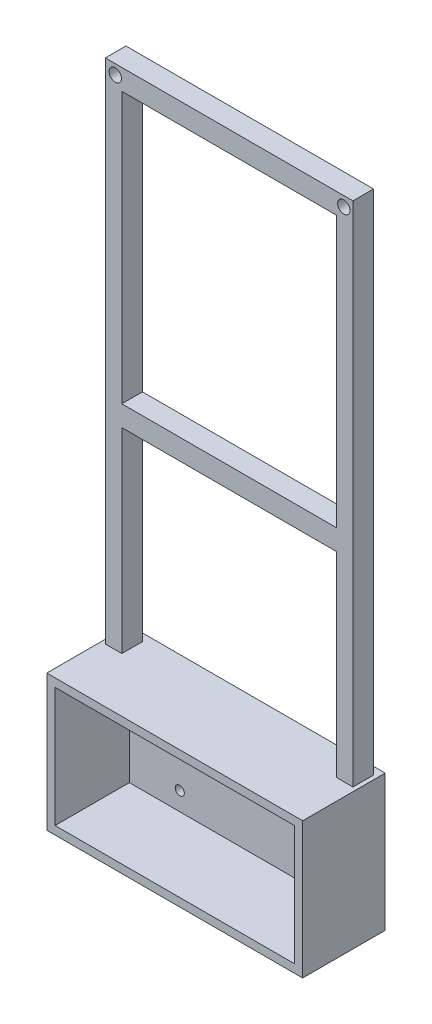
ISO-10303-21;
HEADER;
FILE_DESCRIPTION(('STEP AP214'),'2;1');
FILE_NAME('part.step','',(''),(''),'','','');
FILE_SCHEMA(('AUTOMOTIVE_DESIGN { 1 0 10303 214 1 1 1 1 }'));
ENDSEC;
DATA;
#1=APPLICATION_CONTEXT('core data for automotive mechanical design processes');
#2=APPLICATION_PROTOCOL_DEFINITION('international standard','automotive_design',2000,#1);
#3=PRODUCT_CONTEXT('',#1,'mechanical');
#4=PRODUCT('Part','Part','',(#3));
#5=PRODUCT_RELATED_PRODUCT_CATEGORY('part','',(#4));
#6=PRODUCT_DEFINITION_FORMATION('','',#4);
#7=PRODUCT_DEFINITION_CONTEXT('part definition',#1,'design');
#8=PRODUCT_DEFINITION('design','',#6,#7);
#9=PRODUCT_DEFINITION_SHAPE('','',#8);
#10=(LENGTH_UNIT() NAMED_UNIT(*) SI_UNIT(.MILLI.,.METRE.));
#11=(NAMED_UNIT(*) PLANE_ANGLE_UNIT() SI_UNIT($,.RADIAN.));
#12=(NAMED_UNIT(*) SI_UNIT($,.STERADIAN.) SOLID_ANGLE_UNIT());
#13=UNCERTAINTY_MEASURE_WITH_UNIT(LENGTH_MEASURE(1.E-05),#10,'distance_accuracy_value','');
#14=(GEOMETRIC_REPRESENTATION_CONTEXT(3) GLOBAL_UNCERTAINTY_ASSIGNED_CONTEXT((#13)) GLOBAL_UNIT_ASSIGNED_CONTEXT((#10,
#11,#12)) REPRESENTATION_CONTEXT('',''));
#15=CARTESIAN_POINT('',(0.,0.,0.));
#16=DIRECTION('',(0.,0.,1.));
#17=DIRECTION('',(1.,0.,0.));
#18=AXIS2_PLACEMENT_3D('',#15,#16,#17);
#19=CARTESIAN_POINT('',(26.,139.5,6.82452258581444));
#20=DIRECTION('',(1.,0.,0.));
#21=DIRECTION('',(0.,0.,-1.));
#22=AXIS2_PLACEMENT_3D('',#19,#20,#21);
#23=PLANE('',#22);
#24=DIRECTION('',(0.,0.,1.));
#25=VECTOR('',#24,1.);
#26=CARTESIAN_POINT('',(26.,134.500222113458,6.82452258581444));
#27=LINE('',#26,#25);
#28=CARTESIAN_POINT('',(26.,134.500222113458,1.82452258581444));
#29=VERTEX_POINT('',#28);
#30=CARTESIAN_POINT('',(26.,134.500222113458,6.82452258581444));
#31=VERTEX_POINT('',#30);
#32=EDGE_CURVE('E192',#29,#31,#27,.T.);
#33=ORIENTED_EDGE('',*,*,#32,.F.);
#34=DIRECTION('',(0.,-1.,0.));
#35=VECTOR('',#34,1.);
#36=CARTESIAN_POINT('',(26.,139.5,1.82452258581444));
#37=LINE('',#36,#35);
#38=CARTESIAN_POINT('',(26.,68.9173370042198,1.82452258581444));
#39=VERTEX_POINT('',#38);
#40=EDGE_CURVE('E235',#29,#39,#37,.T.);
#41=ORIENTED_EDGE('',*,*,#40,.T.);
#42=DIRECTION('',(0.,0.,1.));
#43=VECTOR('',#42,1.);
#44=CARTESIAN_POINT('',(26.,68.9173370042198,6.82452258581444));
#45=LINE('',#44,#43);
#46=CARTESIAN_POINT('',(26.,68.9173370042198,6.82452258581444));
#47=VERTEX_POINT('',#46);
#48=EDGE_CURVE('E395',#39,#47,#45,.T.);
#49=ORIENTED_EDGE('',*,*,#48,.T.);
#50=DIRECTION('',(0.,-1.,0.));
#51=VECTOR('',#50,1.);
#52=CARTESIAN_POINT('',(26.,139.5,6.82452258581444));
#53=LINE('',#52,#51);
#54=EDGE_CURVE('E62',#31,#47,#53,.T.);
#55=ORIENTED_EDGE('',*,*,#54,.F.);
#56=EDGE_LOOP('',(#33,#41,#49,#55));
#57=FACE_BOUND('',#56,.T.);
#58=ADVANCED_FACE('F44',(#57),#23,.F.);
#59=CARTESIAN_POINT('',(-26.,139.5,6.82452258581444));
#60=DIRECTION('',(-1.,0.,0.));
#61=DIRECTION('',(0.,0.,1.));
#62=AXIS2_PLACEMENT_3D('',#59,#60,#61);
#63=PLANE('',#62);
#64=DIRECTION('',(0.,0.,-1.));
#65=VECTOR('',#64,1.);
#66=CARTESIAN_POINT('',(-26.,134.500222113458,6.82452258581444));
#67=LINE('',#66,#65);
#68=CARTESIAN_POINT('',(-26.,134.500222113458,6.82452258581444));
#69=VERTEX_POINT('',#68);
#70=CARTESIAN_POINT('',(-26.,134.500222113458,1.82452258581444));
#71=VERTEX_POINT('',#70);
#72=EDGE_CURVE('E189',#69,#71,#67,.T.);
#73=ORIENTED_EDGE('',*,*,#72,.F.);
#74=DIRECTION('',(0.,-1.,0.));
#75=VECTOR('',#74,1.);
#76=CARTESIAN_POINT('',(-26.,139.5,6.82452258581444));
#77=LINE('',#76,#75);
#78=CARTESIAN_POINT('',(-26.,68.9173370042198,6.82452258581444));
#79=VERTEX_POINT('',#78);
#80=EDGE_CURVE('E200',#69,#79,#77,.T.);
#81=ORIENTED_EDGE('',*,*,#80,.T.);
#82=DIRECTION('',(0.,0.,-1.));
#83=VECTOR('',#82,1.);
#84=CARTESIAN_POINT('',(-26.,68.9173370042198,6.82452258581444));
#85=LINE('',#84,#83);
#86=CARTESIAN_POINT('',(-26.,68.9173370042198,1.82452258581444));
#87=VERTEX_POINT('',#86);
#88=EDGE_CURVE('E384',#79,#87,#85,.T.);
#89=ORIENTED_EDGE('',*,*,#88,.T.);
#90=DIRECTION('',(0.,-1.,0.));
#91=VECTOR('',#90,1.);
#92=CARTESIAN_POINT('',(-26.,139.5,1.82452258581444));
#93=LINE('',#92,#91);
#94=EDGE_CURVE('E201',#71,#87,#93,.T.);
#95=ORIENTED_EDGE('',*,*,#94,.F.);
#96=EDGE_LOOP('',(#73,#81,#89,#95));
#97=FACE_BOUND('',#96,.T.);
#98=ADVANCED_FACE('F198',(#97),#63,.F.);
#99=DIRECTION('',(0.,0.,1.));
#100=VECTOR('',#99,1.);
#101=CARTESIAN_POINT('',(26.,63.9173370042198,6.82452258581444));
#102=LINE('',#101,#100);
#103=CARTESIAN_POINT('',(26.,63.9173370042198,1.82452258581444));
#104=VERTEX_POINT('',#103);
#105=CARTESIAN_POINT('',(26.,63.9173370042198,6.82452258581444));
#106=VERTEX_POINT('',#105);
#107=EDGE_CURVE('E234',#104,#106,#102,.T.);
#108=ORIENTED_EDGE('',*,*,#107,.F.);
#109=CARTESIAN_POINT('',(26.,16.5,1.82452258581444));
#110=VERTEX_POINT('',#109);
#111=EDGE_CURVE('E233',#104,#110,#37,.T.);
#112=ORIENTED_EDGE('',*,*,#111,.T.);
#113=DIRECTION('',(0.,0.,1.));
#114=VECTOR('',#113,1.);
#115=CARTESIAN_POINT('',(26.,16.5,6.82452258581444));
#116=LINE('',#115,#114);
#117=CARTESIAN_POINT('',(26.,16.5,6.82452258581444));
#118=VERTEX_POINT('',#117);
#119=EDGE_CURVE('E250',#110,#118,#116,.T.);
#120=ORIENTED_EDGE('',*,*,#119,.T.);
#121=EDGE_CURVE('E238',#106,#118,#53,.T.);
#122=ORIENTED_EDGE('',*,*,#121,.F.);
#123=EDGE_LOOP('',(#108,#112,#120,#122));
#124=FACE_BOUND('',#123,.T.);
#125=ADVANCED_FACE('F444',(#124),#23,.F.);
#126=DIRECTION('',(0.,0.,-1.));
#127=VECTOR('',#126,1.);
#128=CARTESIAN_POINT('',(-26.,63.9173370042198,6.82452258581444));
#129=LINE('',#128,#127);
#130=CARTESIAN_POINT('',(-26.,63.9173370042198,6.82452258581444));
#131=VERTEX_POINT('',#130);
#132=CARTESIAN_POINT('',(-26.,63.9173370042198,1.82452258581444));
#133=VERTEX_POINT('',#132);
#134=EDGE_CURVE('E387',#131,#133,#129,.T.);
#135=ORIENTED_EDGE('',*,*,#134,.F.);
#136=CARTESIAN_POINT('',(-26.,16.5,6.82452258581444));
#137=VERTEX_POINT('',#136);
#138=EDGE_CURVE('E211',#131,#137,#77,.T.);
#139=ORIENTED_EDGE('',*,*,#138,.T.);
#140=DIRECTION('',(0.,0.,-1.));
#141=VECTOR('',#140,1.);
#142=CARTESIAN_POINT('',(-26.,16.5,6.82452258581444));
#143=LINE('',#142,#141);
#144=CARTESIAN_POINT('',(-26.,16.5,1.82452258581444));
#145=VERTEX_POINT('',#144);
#146=EDGE_CURVE('E262',#137,#145,#143,.T.);
#147=ORIENTED_EDGE('',*,*,#146,.T.);
#148=EDGE_CURVE('E70',#133,#145,#93,.T.);
#149=ORIENTED_EDGE('',*,*,#148,.F.);
#150=EDGE_LOOP('',(#135,#139,#147,#149));
#151=FACE_BOUND('',#150,.T.);
#152=ADVANCED_FACE('F437',(#151),#63,.F.);
#153=CARTESIAN_POINT('',(-31.,16.5,20.));
#154=DIRECTION('',(0.,-1.,0.));
#155=DIRECTION('',(0.,0.,-1.));
#156=AXIS2_PLACEMENT_3D('',#153,#154,#155);
#157=PLANE('',#156);
#158=DIRECTION('',(0.,0.,-1.));
#159=VECTOR('',#158,1.);
#160=CARTESIAN_POINT('',(30.,16.5,6.82452258581444));
#161=LINE('',#160,#159);
#162=CARTESIAN_POINT('',(30.,16.5,6.82452258581444));
#163=VERTEX_POINT('',#162);
#164=CARTESIAN_POINT('',(30.,16.5,1.82452258581444));
#165=VERTEX_POINT('',#164);
#166=EDGE_CURVE('E258',#163,#165,#161,.T.);
#167=ORIENTED_EDGE('',*,*,#166,.F.);
#168=DIRECTION('',(1.,0.,0.));
#169=VECTOR('',#168,1.);
#170=CARTESIAN_POINT('',(26.,16.5,6.82452258581444));
#171=LINE('',#170,#169);
#172=EDGE_CURVE('E246',#118,#163,#171,.T.);
#173=ORIENTED_EDGE('',*,*,#172,.F.);
#174=ORIENTED_EDGE('',*,*,#119,.F.);
#175=DIRECTION('',(-1.,0.,0.));
#176=VECTOR('',#175,1.);
#177=CARTESIAN_POINT('',(26.,16.5,1.82452258581444));
#178=LINE('',#177,#176);
#179=EDGE_CURVE('E254',#165,#110,#178,.T.);
#180=ORIENTED_EDGE('',*,*,#179,.F.);
#181=EDGE_LOOP('',(#167,#173,#174,#180));
#182=FACE_BOUND('',#181,.T.);
#183=DIRECTION('',(-1.,0.,0.));
#184=VECTOR('',#183,1.);
#185=CARTESIAN_POINT('',(-31.,16.5,0.));
#186=LINE('',#185,#184);
#187=CARTESIAN_POINT('',(31.,16.5,0.));
#188=VERTEX_POINT('',#187);
#189=CARTESIAN_POINT('',(-31.,16.5,0.));
#190=VERTEX_POINT('',#189);
#191=EDGE_CURVE('E326',#188,#190,#186,.T.);
#192=ORIENTED_EDGE('',*,*,#191,.T.);
#193=DIRECTION('',(0.,0.,-1.));
#194=VECTOR('',#193,1.);
#195=CARTESIAN_POINT('',(-31.,16.5,20.));
#196=LINE('',#195,#194);
#197=CARTESIAN_POINT('',(-31.,16.5,20.));
#198=VERTEX_POINT('',#197);
#199=EDGE_CURVE('E54',#198,#190,#196,.T.);
#200=ORIENTED_EDGE('',*,*,#199,.F.);
#201=DIRECTION('',(-1.,0.,0.));
#202=VECTOR('',#201,1.);
#203=CARTESIAN_POINT('',(-31.,16.5,20.));
#204=LINE('',#203,#202);
#205=CARTESIAN_POINT('',(31.,16.5,20.));
#206=VERTEX_POINT('',#205);
#207=EDGE_CURVE('E312',#206,#198,#204,.T.);
#208=ORIENTED_EDGE('',*,*,#207,.F.);
#209=DIRECTION('',(0.,0.,-1.));
#210=VECTOR('',#209,1.);
#211=CARTESIAN_POINT('',(31.,16.5,20.));
#212=LINE('',#211,#210);
#213=EDGE_CURVE('E11',#206,#188,#212,.T.);
#214=ORIENTED_EDGE('',*,*,#213,.T.);
#215=EDGE_LOOP('',(#192,#200,#208,#214));
#216=FACE_BOUND('',#215,.T.);
#217=ORIENTED_EDGE('',*,*,#146,.F.);
#218=DIRECTION('',(1.,0.,0.));
#219=VECTOR('',#218,1.);
#220=CARTESIAN_POINT('',(-30.,16.5,6.82452258581444));
#221=LINE('',#220,#219);
#222=CARTESIAN_POINT('',(-30.,16.5,6.82452258581444));
#223=VERTEX_POINT('',#222);
#224=EDGE_CURVE('E220',#223,#137,#221,.T.);
#225=ORIENTED_EDGE('',*,*,#224,.F.);
#226=DIRECTION('',(0.,0.,1.));
#227=VECTOR('',#226,1.);
#228=CARTESIAN_POINT('',(-30.,16.5,6.82452258581444));
#229=LINE('',#228,#227);
#230=CARTESIAN_POINT('',(-30.,16.5,1.82452258581444));
#231=VERTEX_POINT('',#230);
#232=EDGE_CURVE('E423',#231,#223,#229,.T.);
#233=ORIENTED_EDGE('',*,*,#232,.F.);
#234=DIRECTION('',(-1.,0.,0.));
#235=VECTOR('',#234,1.);
#236=CARTESIAN_POINT('',(-30.,16.5,1.82452258581444));
#237=LINE('',#236,#235);
#238=EDGE_CURVE('E420',#145,#231,#237,.T.);
#239=ORIENTED_EDGE('',*,*,#238,.F.);
#240=EDGE_LOOP('',(#217,#225,#233,#239));
#241=FACE_BOUND('',#240,.T.);
#242=ADVANCED_FACE('F435',(#182,#216,#241),#157,.F.);
#243=CARTESIAN_POINT('',(0.,0.,20.));
#244=DIRECTION('',(0.,0.,-1.));
#245=DIRECTION('',(-1.,0.,0.));
#246=AXIS2_PLACEMENT_3D('',#243,#244,#245);
#247=PLANE('',#246);
#248=DIRECTION('',(0.,1.,0.));
#249=VECTOR('',#248,1.);
#250=CARTESIAN_POINT('',(31.,-16.5,20.));
#251=LINE('',#250,#249);
#252=CARTESIAN_POINT('',(31.,-16.5,20.));
#253=VERTEX_POINT('',#252);
#254=EDGE_CURVE('E308',#253,#206,#251,.T.);
#255=ORIENTED_EDGE('',*,*,#254,.T.);
#256=ORIENTED_EDGE('',*,*,#207,.T.);
#257=DIRECTION('',(0.,-1.,0.));
#258=VECTOR('',#257,1.);
#259=CARTESIAN_POINT('',(-31.,-16.5,20.));
#260=LINE('',#259,#258);
#261=CARTESIAN_POINT('',(-31.,-16.5,20.));
#262=VERTEX_POINT('',#261);
#263=EDGE_CURVE('E316',#198,#262,#260,.T.);
#264=ORIENTED_EDGE('',*,*,#263,.T.);
#265=DIRECTION('',(1.,0.,0.));
#266=VECTOR('',#265,1.);
#267=CARTESIAN_POINT('',(-31.,-16.5,20.));
#268=LINE('',#267,#266);
#269=EDGE_CURVE('E319',#262,#253,#268,.T.);
#270=ORIENTED_EDGE('',*,*,#269,.T.);
#271=EDGE_LOOP('',(#255,#256,#264,#270));
#272=FACE_BOUND('',#271,.T.);
#273=DIRECTION('',(0.,1.,0.));
#274=VECTOR('',#273,1.);
#275=CARTESIAN_POINT('',(29.,0.,20.));
#276=LINE('',#275,#274);
#277=CARTESIAN_POINT('',(29.,-14.5,20.));
#278=VERTEX_POINT('',#277);
#279=CARTESIAN_POINT('',(29.,14.5,20.));
#280=VERTEX_POINT('',#279);
#281=EDGE_CURVE('E296',#278,#280,#276,.T.);
#282=ORIENTED_EDGE('',*,*,#281,.F.);
#283=DIRECTION('',(1.,0.,0.));
#284=VECTOR('',#283,1.);
#285=CARTESIAN_POINT('',(0.,-14.5,20.));
#286=LINE('',#285,#284);
#287=CARTESIAN_POINT('',(-29.,-14.5,20.));
#288=VERTEX_POINT('',#287);
#289=EDGE_CURVE('E281',#288,#278,#286,.T.);
#290=ORIENTED_EDGE('',*,*,#289,.F.);
#291=DIRECTION('',(0.,-1.,0.));
#292=VECTOR('',#291,1.);
#293=CARTESIAN_POINT('',(-29.,0.,20.));
#294=LINE('',#293,#292);
#295=CARTESIAN_POINT('',(-29.,14.5,20.));
#296=VERTEX_POINT('',#295);
#297=EDGE_CURVE('E302',#296,#288,#294,.T.);
#298=ORIENTED_EDGE('',*,*,#297,.F.);
#299=DIRECTION('',(-1.,0.,0.));
#300=VECTOR('',#299,1.);
#301=CARTESIAN_POINT('',(0.,14.5,20.));
#302=LINE('',#301,#300);
#303=EDGE_CURVE('E299',#280,#296,#302,.T.);
#304=ORIENTED_EDGE('',*,*,#303,.F.);
#305=EDGE_LOOP('',(#282,#290,#298,#304));
#306=FACE_BOUND('',#305,.T.);
#307=ADVANCED_FACE('F491',(#272,#306),#247,.F.);
#308=CARTESIAN_POINT('',(31.,-16.5,20.));
#309=DIRECTION('',(-1.,0.,0.));
#310=DIRECTION('',(0.,0.,1.));
#311=AXIS2_PLACEMENT_3D('',#308,#309,#310);
#312=PLANE('',#311);
#313=DIRECTION('',(0.,1.,0.));
#314=VECTOR('',#313,1.);
#315=CARTESIAN_POINT('',(31.,-16.5,0.));
#316=LINE('',#315,#314);
#317=CARTESIAN_POINT('',(31.,-16.5,0.));
#318=VERTEX_POINT('',#317);
#319=EDGE_CURVE('E274',#318,#188,#316,.T.);
#320=ORIENTED_EDGE('',*,*,#319,.T.);
#321=ORIENTED_EDGE('',*,*,#213,.F.);
#322=ORIENTED_EDGE('',*,*,#254,.F.);
#323=DIRECTION('',(0.,0.,-1.));
#324=VECTOR('',#323,1.);
#325=CARTESIAN_POINT('',(31.,-16.5,20.));
#326=LINE('',#325,#324);
#327=EDGE_CURVE('E322',#253,#318,#326,.T.);
#328=ORIENTED_EDGE('',*,*,#327,.T.);
#329=EDGE_LOOP('',(#320,#321,#322,#328));
#330=FACE_BOUND('',#329,.T.);
#331=ADVANCED_FACE('F46',(#330),#312,.F.);
#332=CARTESIAN_POINT('',(-31.,-16.5,20.));
#333=DIRECTION('',(1.,0.,0.));
#334=DIRECTION('',(0.,0.,-1.));
#335=AXIS2_PLACEMENT_3D('',#332,#333,#334);
#336=PLANE('',#335);
#337=DIRECTION('',(0.,-1.,0.));
#338=VECTOR('',#337,1.);
#339=CARTESIAN_POINT('',(-31.,-16.5,0.));
#340=LINE('',#339,#338);
#341=CARTESIAN_POINT('',(-31.,-16.5,0.));
#342=VERTEX_POINT('',#341);
#343=EDGE_CURVE('E329',#190,#342,#340,.T.);
#344=ORIENTED_EDGE('',*,*,#343,.T.);
#345=DIRECTION('',(0.,0.,-1.));
#346=VECTOR('',#345,1.);
#347=CARTESIAN_POINT('',(-31.,-16.5,20.));
#348=LINE('',#347,#346);
#349=EDGE_CURVE('E337',#262,#342,#348,.T.);
#350=ORIENTED_EDGE('',*,*,#349,.F.);
#351=ORIENTED_EDGE('',*,*,#263,.F.);
#352=ORIENTED_EDGE('',*,*,#199,.T.);
#353=EDGE_LOOP('',(#344,#350,#351,#352));
#354=FACE_BOUND('',#353,.T.);
#355=ADVANCED_FACE('F518',(#354),#336,.F.);
#356=CARTESIAN_POINT('',(-31.,-16.5,20.));
#357=DIRECTION('',(0.,1.,0.));
#358=DIRECTION('',(0.,0.,1.));
#359=AXIS2_PLACEMENT_3D('',#356,#357,#358);
#360=PLANE('',#359);
#361=DIRECTION('',(1.,0.,0.));
#362=VECTOR('',#361,1.);
#363=CARTESIAN_POINT('',(-31.,-16.5,0.));
#364=LINE('',#363,#362);
#365=EDGE_CURVE('E313',#342,#318,#364,.T.);
#366=ORIENTED_EDGE('',*,*,#365,.T.);
#367=ORIENTED_EDGE('',*,*,#327,.F.);
#368=ORIENTED_EDGE('',*,*,#269,.F.);
#369=ORIENTED_EDGE('',*,*,#349,.T.);
#370=EDGE_LOOP('',(#366,#367,#368,#369));
#371=FACE_BOUND('',#370,.T.);
#372=ADVANCED_FACE('F514',(#371),#360,.F.);
#373=CARTESIAN_POINT('',(0.,0.,0.));
#374=DIRECTION('',(0.,0.,-1.));
#375=DIRECTION('',(-1.,0.,0.));
#376=AXIS2_PLACEMENT_3D('',#373,#374,#375);
#377=PLANE('',#376);
#378=CARTESIAN_POINT('',(-16.7815720595793,9.95930811028381,0.));
#379=DIRECTION('',(0.,0.,-1.));
#380=DIRECTION('',(-1.,0.,0.));
#381=AXIS2_PLACEMENT_3D('',#378,#379,#380);
#382=CIRCLE('',#381,1.10000000000008);
#383=CARTESIAN_POINT('',(-17.8815720595794,9.95930811028381,0.));
#384=VERTEX_POINT('',#383);
#385=EDGE_CURVE('E729',#384,#384,#382,.T.);
#386=ORIENTED_EDGE('',*,*,#385,.F.);
#387=EDGE_LOOP('',(#386));
#388=FACE_BOUND('',#387,.T.);
#389=CARTESIAN_POINT('',(-16.7815720595793,-10.0406918897162,0.));
#390=DIRECTION('',(0.,0.,-1.));
#391=DIRECTION('',(-1.,0.,0.));
#392=AXIS2_PLACEMENT_3D('',#389,#390,#391);
#393=CIRCLE('',#392,1.10000000000008);
#394=CARTESIAN_POINT('',(-17.8815720595794,-10.0406918897162,0.));
#395=VERTEX_POINT('',#394);
#396=EDGE_CURVE('E731',#395,#395,#393,.T.);
#397=ORIENTED_EDGE('',*,*,#396,.F.);
#398=EDGE_LOOP('',(#397));
#399=FACE_BOUND('',#398,.T.);
#400=CARTESIAN_POINT('',(18.2184279404207,-10.0406918897162,0.));
#401=DIRECTION('',(0.,0.,-1.));
#402=DIRECTION('',(-1.,0.,0.));
#403=AXIS2_PLACEMENT_3D('',#400,#401,#402);
#404=CIRCLE('',#403,1.10000000000008);
#405=CARTESIAN_POINT('',(17.1184279404207,-10.0406918897162,0.));
#406=VERTEX_POINT('',#405);
#407=EDGE_CURVE('E735',#406,#406,#404,.T.);
#408=ORIENTED_EDGE('',*,*,#407,.F.);
#409=EDGE_LOOP('',(#408));
#410=FACE_BOUND('',#409,.T.);
#411=CARTESIAN_POINT('',(18.2184279404207,9.95930811028381,0.));
#412=DIRECTION('',(0.,0.,-1.));
#413=DIRECTION('',(-1.,0.,0.));
#414=AXIS2_PLACEMENT_3D('',#411,#412,#413);
#415=CIRCLE('',#414,1.10000000000008);
#416=CARTESIAN_POINT('',(17.1184279404207,9.95930811028381,0.));
#417=VERTEX_POINT('',#416);
#418=EDGE_CURVE('E349',#417,#417,#415,.T.);
#419=ORIENTED_EDGE('',*,*,#418,.F.);
#420=EDGE_LOOP('',(#419));
#421=FACE_BOUND('',#420,.T.);
#422=ORIENTED_EDGE('',*,*,#319,.F.);
#423=ORIENTED_EDGE('',*,*,#365,.F.);
#424=ORIENTED_EDGE('',*,*,#343,.F.);
#425=ORIENTED_EDGE('',*,*,#191,.F.);
#426=EDGE_LOOP('',(#422,#423,#424,#425));
#427=FACE_BOUND('',#426,.T.);
#428=ADVANCED_FACE('F511',(#388,#399,#410,#421,#427),#377,.T.);
#429=CARTESIAN_POINT('',(29.,-16.5,20.));
#430=DIRECTION('',(-1.,0.,0.));
#431=DIRECTION('',(0.,0.,1.));
#432=AXIS2_PLACEMENT_3D('',#429,#430,#431);
#433=PLANE('',#432);
#434=DIRECTION('',(0.,1.,0.));
#435=VECTOR('',#434,1.);
#436=CARTESIAN_POINT('',(29.,0.,2.));
#437=LINE('',#436,#435);
#438=CARTESIAN_POINT('',(29.,-14.5,2.));
#439=VERTEX_POINT('',#438);
#440=CARTESIAN_POINT('',(29.,14.5,2.));
#441=VERTEX_POINT('',#440);
#442=EDGE_CURVE('E228',#439,#441,#437,.T.);
#443=ORIENTED_EDGE('',*,*,#442,.F.);
#444=DIRECTION('',(0.,0.,-1.));
#445=VECTOR('',#444,1.);
#446=CARTESIAN_POINT('',(29.,-14.5,20.));
#447=LINE('',#446,#445);
#448=EDGE_CURVE('E276',#278,#439,#447,.T.);
#449=ORIENTED_EDGE('',*,*,#448,.F.);
#450=ORIENTED_EDGE('',*,*,#281,.T.);
#451=DIRECTION('',(0.,0.,-1.));
#452=VECTOR('',#451,1.);
#453=CARTESIAN_POINT('',(29.,14.5,20.));
#454=LINE('',#453,#452);
#455=EDGE_CURVE('E270',#280,#441,#454,.T.);
#456=ORIENTED_EDGE('',*,*,#455,.T.);
#457=EDGE_LOOP('',(#443,#449,#450,#456));
#458=FACE_BOUND('',#457,.T.);
#459=ADVANCED_FACE('F513',(#458),#433,.T.);
#460=CARTESIAN_POINT('',(-31.,14.5,20.));
#461=DIRECTION('',(0.,-1.,0.));
#462=DIRECTION('',(0.,0.,-1.));
#463=AXIS2_PLACEMENT_3D('',#460,#461,#462);
#464=PLANE('',#463);
#465=DIRECTION('',(-1.,0.,0.));
#466=VECTOR('',#465,1.);
#467=CARTESIAN_POINT('',(0.,14.5,2.));
#468=LINE('',#467,#466);
#469=CARTESIAN_POINT('',(-29.,14.5,2.));
#470=VERTEX_POINT('',#469);
#471=EDGE_CURVE('E269',#441,#470,#468,.T.);
#472=ORIENTED_EDGE('',*,*,#471,.F.);
#473=ORIENTED_EDGE('',*,*,#455,.F.);
#474=ORIENTED_EDGE('',*,*,#303,.T.);
#475=DIRECTION('',(0.,0.,-1.));
#476=VECTOR('',#475,1.);
#477=CARTESIAN_POINT('',(-29.,14.5,20.));
#478=LINE('',#477,#476);
#479=EDGE_CURVE('E275',#296,#470,#478,.T.);
#480=ORIENTED_EDGE('',*,*,#479,.T.);
#481=EDGE_LOOP('',(#472,#473,#474,#480));
#482=FACE_BOUND('',#481,.T.);
#483=ADVANCED_FACE('F547',(#482),#464,.T.);
#484=CARTESIAN_POINT('',(-29.,-16.5,20.));
#485=DIRECTION('',(1.,0.,0.));
#486=DIRECTION('',(0.,0.,-1.));
#487=AXIS2_PLACEMENT_3D('',#484,#485,#486);
#488=PLANE('',#487);
#489=DIRECTION('',(0.,-1.,0.));
#490=VECTOR('',#489,1.);
#491=CARTESIAN_POINT('',(-29.,0.,2.));
#492=LINE('',#491,#490);
#493=CARTESIAN_POINT('',(-29.,-14.5,2.));
#494=VERTEX_POINT('',#493);
#495=EDGE_CURVE('E284',#470,#494,#492,.T.);
#496=ORIENTED_EDGE('',*,*,#495,.F.);
#497=ORIENTED_EDGE('',*,*,#479,.F.);
#498=ORIENTED_EDGE('',*,*,#297,.T.);
#499=DIRECTION('',(0.,0.,-1.));
#500=VECTOR('',#499,1.);
#501=CARTESIAN_POINT('',(-29.,-14.5,20.));
#502=LINE('',#501,#500);
#503=EDGE_CURVE('E280',#288,#494,#502,.T.);
#504=ORIENTED_EDGE('',*,*,#503,.T.);
#505=EDGE_LOOP('',(#496,#497,#498,#504));
#506=FACE_BOUND('',#505,.T.);
#507=ADVANCED_FACE('F503',(#506),#488,.T.);
#508=CARTESIAN_POINT('',(-31.,-14.5,20.));
#509=DIRECTION('',(0.,1.,0.));
#510=DIRECTION('',(0.,0.,1.));
#511=AXIS2_PLACEMENT_3D('',#508,#509,#510);
#512=PLANE('',#511);
#513=DIRECTION('',(1.,0.,0.));
#514=VECTOR('',#513,1.);
#515=CARTESIAN_POINT('',(0.,-14.5,2.));
#516=LINE('',#515,#514);
#517=EDGE_CURVE('E290',#494,#439,#516,.T.);
#518=ORIENTED_EDGE('',*,*,#517,.F.);
#519=ORIENTED_EDGE('',*,*,#503,.F.);
#520=ORIENTED_EDGE('',*,*,#289,.T.);
#521=ORIENTED_EDGE('',*,*,#448,.T.);
#522=EDGE_LOOP('',(#518,#519,#520,#521));
#523=FACE_BOUND('',#522,.T.);
#524=ADVANCED_FACE('F496',(#523),#512,.T.);
#525=CARTESIAN_POINT('',(0.,0.,2.));
#526=DIRECTION('',(0.,0.,-1.));
#527=DIRECTION('',(-1.,0.,0.));
#528=AXIS2_PLACEMENT_3D('',#525,#526,#527);
#529=PLANE('',#528);
#530=CARTESIAN_POINT('',(-16.7815720595793,9.95930811028381,2.));
#531=DIRECTION('',(0.,0.,-1.));
#532=DIRECTION('',(-1.,0.,0.));
#533=AXIS2_PLACEMENT_3D('',#530,#531,#532);
#534=CIRCLE('',#533,1.10000000000008);
#535=CARTESIAN_POINT('',(-17.8815720595794,9.95930811028381,2.));
#536=VERTEX_POINT('',#535);
#537=EDGE_CURVE('E48',#536,#536,#534,.T.);
#538=ORIENTED_EDGE('',*,*,#537,.T.);
#539=EDGE_LOOP('',(#538));
#540=FACE_BOUND('',#539,.T.);
#541=CARTESIAN_POINT('',(-16.7815720595793,-10.0406918897162,2.));
#542=DIRECTION('',(0.,0.,-1.));
#543=DIRECTION('',(-1.,0.,0.));
#544=AXIS2_PLACEMENT_3D('',#541,#542,#543);
#545=CIRCLE('',#544,1.10000000000008);
#546=CARTESIAN_POINT('',(-17.8815720595794,-10.0406918897162,2.));
#547=VERTEX_POINT('',#546);
#548=EDGE_CURVE('E352',#547,#547,#545,.T.);
#549=ORIENTED_EDGE('',*,*,#548,.T.);
#550=EDGE_LOOP('',(#549));
#551=FACE_BOUND('',#550,.T.);
#552=CARTESIAN_POINT('',(18.2184279404207,-10.0406918897162,2.));
#553=DIRECTION('',(0.,0.,-1.));
#554=DIRECTION('',(-1.,0.,0.));
#555=AXIS2_PLACEMENT_3D('',#552,#553,#554);
#556=CIRCLE('',#555,1.10000000000008);
#557=CARTESIAN_POINT('',(17.1184279404207,-10.0406918897162,2.));
#558=VERTEX_POINT('',#557);
#559=EDGE_CURVE('E348',#558,#558,#556,.T.);
#560=ORIENTED_EDGE('',*,*,#559,.T.);
#561=EDGE_LOOP('',(#560));
#562=FACE_BOUND('',#561,.T.);
#563=CARTESIAN_POINT('',(18.2184279404207,9.95930811028381,2.));
#564=DIRECTION('',(0.,0.,-1.));
#565=DIRECTION('',(-1.,0.,0.));
#566=AXIS2_PLACEMENT_3D('',#563,#564,#565);
#567=CIRCLE('',#566,1.10000000000008);
#568=CARTESIAN_POINT('',(17.1184279404207,9.95930811028381,2.));
#569=VERTEX_POINT('',#568);
#570=EDGE_CURVE('E344',#569,#569,#567,.T.);
#571=ORIENTED_EDGE('',*,*,#570,.T.);
#572=EDGE_LOOP('',(#571));
#573=FACE_BOUND('',#572,.T.);
#574=ORIENTED_EDGE('',*,*,#442,.T.);
#575=ORIENTED_EDGE('',*,*,#471,.T.);
#576=ORIENTED_EDGE('',*,*,#495,.T.);
#577=ORIENTED_EDGE('',*,*,#517,.T.);
#578=EDGE_LOOP('',(#574,#575,#576,#577));
#579=FACE_BOUND('',#578,.T.);
#580=ADVANCED_FACE('F492',(#540,#551,#562,#573,#579),#529,.F.);
#581=CARTESIAN_POINT('',(30.,139.5,6.82452258581444));
#582=DIRECTION('',(-1.,0.,0.));
#583=DIRECTION('',(0.,0.,1.));
#584=AXIS2_PLACEMENT_3D('',#581,#582,#583);
#585=PLANE('',#584);
#586=ORIENTED_EDGE('',*,*,#166,.T.);
#587=DIRECTION('',(0.,-1.,0.));
#588=VECTOR('',#587,1.);
#589=CARTESIAN_POINT('',(30.,139.5,1.82452258581444));
#590=LINE('',#589,#588);
#591=CARTESIAN_POINT('',(30.,139.5,1.82452258581444));
#592=VERTEX_POINT('',#591);
#593=EDGE_CURVE('E229',#592,#165,#590,.T.);
#594=ORIENTED_EDGE('',*,*,#593,.F.);
#595=DIRECTION('',(0.,0.,-1.));
#596=VECTOR('',#595,1.);
#597=CARTESIAN_POINT('',(30.,139.5,6.82452258581444));
#598=LINE('',#597,#596);
#599=CARTESIAN_POINT('',(30.,139.5,6.82452258581444));
#600=VERTEX_POINT('',#599);
#601=EDGE_CURVE('E245',#600,#592,#598,.T.);
#602=ORIENTED_EDGE('',*,*,#601,.F.);
#603=DIRECTION('',(0.,-1.,0.));
#604=VECTOR('',#603,1.);
#605=CARTESIAN_POINT('',(30.,139.5,6.82452258581444));
#606=LINE('',#605,#604);
#607=EDGE_CURVE('E241',#600,#163,#606,.T.);
#608=ORIENTED_EDGE('',*,*,#607,.T.);
#609=EDGE_LOOP('',(#586,#594,#602,#608));
#610=FACE_BOUND('',#609,.T.);
#611=ADVANCED_FACE('F457',(#610),#585,.F.);
#612=CARTESIAN_POINT('',(-30.,139.5,1.82452258581444));
#613=DIRECTION('',(0.,0.,1.));
#614=DIRECTION('',(1.,0.,0.));
#615=AXIS2_PLACEMENT_3D('',#612,#613,#614);
#616=PLANE('',#615);
#617=CARTESIAN_POINT('',(-27.5881798026908,137.122373112526,1.82452258581444));
#618=DIRECTION('',(0.,0.,1.));
#619=DIRECTION('',(1.,0.,0.));
#620=AXIS2_PLACEMENT_3D('',#617,#618,#619);
#621=CIRCLE('',#620,1.5);
#622=CARTESIAN_POINT('',(-26.0881798026908,137.122373112526,1.82452258581444));
#623=VERTEX_POINT('',#622);
#624=EDGE_CURVE('E203',#623,#623,#621,.T.);
#625=ORIENTED_EDGE('',*,*,#624,.T.);
#626=EDGE_LOOP('',(#625));
#627=FACE_BOUND('',#626,.T.);
#628=CARTESIAN_POINT('',(27.8022545228368,137.122373112526,1.82452258581443));
#629=DIRECTION('',(0.,0.,1.));
#630=DIRECTION('',(1.,0.,0.));
#631=AXIS2_PLACEMENT_3D('',#628,#629,#630);
#632=CIRCLE('',#631,1.5);
#633=CARTESIAN_POINT('',(29.3022545228368,137.122373112526,1.82452258581443));
#634=VERTEX_POINT('',#633);
#635=EDGE_CURVE('E370',#634,#634,#632,.T.);
#636=ORIENTED_EDGE('',*,*,#635,.T.);
#637=EDGE_LOOP('',(#636));
#638=FACE_BOUND('',#637,.T.);
#639=ORIENTED_EDGE('',*,*,#40,.F.);
#640=DIRECTION('',(-1.,0.,0.));
#641=VECTOR('',#640,1.);
#642=CARTESIAN_POINT('',(27.,134.500222113458,1.82452258581444));
#643=LINE('',#642,#641);
#644=EDGE_CURVE('E195',#29,#71,#643,.T.);
#645=ORIENTED_EDGE('',*,*,#644,.T.);
#646=ORIENTED_EDGE('',*,*,#94,.T.);
#647=DIRECTION('',(-1.,0.,0.));
#648=VECTOR('',#647,1.);
#649=CARTESIAN_POINT('',(27.,68.9173370042198,1.82452258581444));
#650=LINE('',#649,#648);
#651=EDGE_CURVE('E399',#39,#87,#650,.T.);
#652=ORIENTED_EDGE('',*,*,#651,.F.);
#653=EDGE_LOOP('',(#639,#645,#646,#652));
#654=FACE_BOUND('',#653,.T.);
#655=DIRECTION('',(-1.,0.,0.));
#656=VECTOR('',#655,1.);
#657=CARTESIAN_POINT('',(-30.,139.5,1.82452258581444));
#658=LINE('',#657,#656);
#659=CARTESIAN_POINT('',(-30.,139.5,1.82452258581444));
#660=VERTEX_POINT('',#659);
#661=EDGE_CURVE('E410',#592,#660,#658,.T.);
#662=ORIENTED_EDGE('',*,*,#661,.F.);
#663=ORIENTED_EDGE('',*,*,#593,.T.);
#664=ORIENTED_EDGE('',*,*,#179,.T.);
#665=ORIENTED_EDGE('',*,*,#111,.F.);
#666=DIRECTION('',(-1.,0.,0.));
#667=VECTOR('',#666,1.);
#668=CARTESIAN_POINT('',(27.,63.9173370042198,1.82452258581444));
#669=LINE('',#668,#667);
#670=EDGE_CURVE('E396',#104,#133,#669,.T.);
#671=ORIENTED_EDGE('',*,*,#670,.T.);
#672=ORIENTED_EDGE('',*,*,#148,.T.);
#673=ORIENTED_EDGE('',*,*,#238,.T.);
#674=DIRECTION('',(0.,-1.,0.));
#675=VECTOR('',#674,1.);
#676=CARTESIAN_POINT('',(-30.,139.5,1.82452258581444));
#677=LINE('',#676,#675);
#678=EDGE_CURVE('E216',#660,#231,#677,.T.);
#679=ORIENTED_EDGE('',*,*,#678,.F.);
#680=EDGE_LOOP('',(#662,#663,#664,#665,#671,#672,#673,#679));
#681=FACE_BOUND('',#680,.T.);
#682=ADVANCED_FACE('F452',(#627,#638,#654,#681),#616,.F.);
#683=CARTESIAN_POINT('',(-30.,139.5,6.82452258581444));
#684=DIRECTION('',(1.,0.,0.));
#685=DIRECTION('',(0.,0.,-1.));
#686=AXIS2_PLACEMENT_3D('',#683,#684,#685);
#687=PLANE('',#686);
#688=ORIENTED_EDGE('',*,*,#232,.T.);
#689=DIRECTION('',(0.,-1.,0.));
#690=VECTOR('',#689,1.);
#691=CARTESIAN_POINT('',(-30.,139.5,6.82452258581444));
#692=LINE('',#691,#690);
#693=CARTESIAN_POINT('',(-30.,139.5,6.82452258581444));
#694=VERTEX_POINT('',#693);
#695=EDGE_CURVE('E210',#694,#223,#692,.T.);
#696=ORIENTED_EDGE('',*,*,#695,.F.);
#697=DIRECTION('',(0.,0.,1.));
#698=VECTOR('',#697,1.);
#699=CARTESIAN_POINT('',(-30.,139.5,6.82452258581444));
#700=LINE('',#699,#698);
#701=EDGE_CURVE('E413',#660,#694,#700,.T.);
#702=ORIENTED_EDGE('',*,*,#701,.F.);
#703=ORIENTED_EDGE('',*,*,#678,.T.);
#704=EDGE_LOOP('',(#688,#696,#702,#703));
#705=FACE_BOUND('',#704,.T.);
#706=ADVANCED_FACE('F461',(#705),#687,.F.);
#707=CARTESIAN_POINT('',(-30.,139.5,6.82452258581444));
#708=DIRECTION('',(0.,0.,-1.));
#709=DIRECTION('',(-1.,0.,0.));
#710=AXIS2_PLACEMENT_3D('',#707,#708,#709);
#711=PLANE('',#710);
#712=CARTESIAN_POINT('',(-27.5881798026908,137.122373112526,6.82452258581444));
#713=DIRECTION('',(0.,0.,1.));
#714=DIRECTION('',(1.,0.,0.));
#715=AXIS2_PLACEMENT_3D('',#712,#713,#714);
#716=CIRCLE('',#715,1.5);
#717=CARTESIAN_POINT('',(-26.0881798026908,137.122373112526,6.82452258581444));
#718=VERTEX_POINT('',#717);
#719=EDGE_CURVE('E364',#718,#718,#716,.T.);
#720=ORIENTED_EDGE('',*,*,#719,.F.);
#721=EDGE_LOOP('',(#720));
#722=FACE_BOUND('',#721,.T.);
#723=CARTESIAN_POINT('',(27.8022545228368,137.122373112526,6.82452258581444));
#724=DIRECTION('',(0.,0.,1.));
#725=DIRECTION('',(1.,0.,0.));
#726=AXIS2_PLACEMENT_3D('',#723,#724,#725);
#727=CIRCLE('',#726,1.5);
#728=CARTESIAN_POINT('',(29.3022545228368,137.122373112526,6.82452258581444));
#729=VERTEX_POINT('',#728);
#730=EDGE_CURVE('E359',#729,#729,#727,.T.);
#731=ORIENTED_EDGE('',*,*,#730,.F.);
#732=EDGE_LOOP('',(#731));
#733=FACE_BOUND('',#732,.T.);
#734=DIRECTION('',(-1.,0.,0.));
#735=VECTOR('',#734,1.);
#736=CARTESIAN_POINT('',(27.,134.500222113458,6.82452258581444));
#737=LINE('',#736,#735);
#738=EDGE_CURVE('E186',#31,#69,#737,.T.);
#739=ORIENTED_EDGE('',*,*,#738,.F.);
#740=ORIENTED_EDGE('',*,*,#54,.T.);
#741=DIRECTION('',(-1.,0.,0.));
#742=VECTOR('',#741,1.);
#743=CARTESIAN_POINT('',(27.,68.9173370042198,6.82452258581444));
#744=LINE('',#743,#742);
#745=EDGE_CURVE('E207',#47,#79,#744,.T.);
#746=ORIENTED_EDGE('',*,*,#745,.T.);
#747=ORIENTED_EDGE('',*,*,#80,.F.);
#748=EDGE_LOOP('',(#739,#740,#746,#747));
#749=FACE_BOUND('',#748,.T.);
#750=ORIENTED_EDGE('',*,*,#607,.F.);
#751=DIRECTION('',(1.,0.,0.));
#752=VECTOR('',#751,1.);
#753=CARTESIAN_POINT('',(-30.,139.5,6.82452258581444));
#754=LINE('',#753,#752);
#755=EDGE_CURVE('E218',#694,#600,#754,.T.);
#756=ORIENTED_EDGE('',*,*,#755,.F.);
#757=ORIENTED_EDGE('',*,*,#695,.T.);
#758=ORIENTED_EDGE('',*,*,#224,.T.);
#759=ORIENTED_EDGE('',*,*,#138,.F.);
#760=DIRECTION('',(-1.,0.,0.));
#761=VECTOR('',#760,1.);
#762=CARTESIAN_POINT('',(27.,63.9173370042198,6.82452258581444));
#763=LINE('',#762,#761);
#764=EDGE_CURVE('E391',#106,#131,#763,.T.);
#765=ORIENTED_EDGE('',*,*,#764,.F.);
#766=ORIENTED_EDGE('',*,*,#121,.T.);
#767=ORIENTED_EDGE('',*,*,#172,.T.);
#768=EDGE_LOOP('',(#750,#756,#757,#758,#759,#765,#766,#767));
#769=FACE_BOUND('',#768,.T.);
#770=ADVANCED_FACE('F205',(#722,#733,#749,#769),#711,.F.);
#771=CARTESIAN_POINT('',(0.,139.5,0.));
#772=DIRECTION('',(0.,-1.,0.));
#773=DIRECTION('',(0.,0.,-1.));
#774=AXIS2_PLACEMENT_3D('',#771,#772,#773);
#775=PLANE('',#774);
#776=ORIENTED_EDGE('',*,*,#755,.T.);
#777=ORIENTED_EDGE('',*,*,#601,.T.);
#778=ORIENTED_EDGE('',*,*,#661,.T.);
#779=ORIENTED_EDGE('',*,*,#701,.T.);
#780=EDGE_LOOP('',(#776,#777,#778,#779));
#781=FACE_BOUND('',#780,.T.);
#782=ADVANCED_FACE('F459',(#781),#775,.F.);
#783=CARTESIAN_POINT('',(27.,63.9173370042198,6.82452258581444));
#784=DIRECTION('',(0.,1.,0.));
#785=DIRECTION('',(0.,0.,1.));
#786=AXIS2_PLACEMENT_3D('',#783,#784,#785);
#787=PLANE('',#786);
#788=ORIENTED_EDGE('',*,*,#670,.F.);
#789=ORIENTED_EDGE('',*,*,#107,.T.);
#790=ORIENTED_EDGE('',*,*,#764,.T.);
#791=ORIENTED_EDGE('',*,*,#134,.T.);
#792=EDGE_LOOP('',(#788,#789,#790,#791));
#793=FACE_BOUND('',#792,.T.);
#794=ADVANCED_FACE('F439',(#793),#787,.F.);
#795=CARTESIAN_POINT('',(27.,68.9173370042198,6.82452258581444));
#796=DIRECTION('',(0.,1.,0.));
#797=DIRECTION('',(0.,0.,1.));
#798=AXIS2_PLACEMENT_3D('',#795,#796,#797);
#799=PLANE('',#798);
#800=ORIENTED_EDGE('',*,*,#48,.F.);
#801=ORIENTED_EDGE('',*,*,#651,.T.);
#802=ORIENTED_EDGE('',*,*,#88,.F.);
#803=ORIENTED_EDGE('',*,*,#745,.F.);
#804=EDGE_LOOP('',(#800,#801,#802,#803));
#805=FACE_BOUND('',#804,.T.);
#806=ADVANCED_FACE('F644',(#805),#799,.T.);
#807=CARTESIAN_POINT('',(27.,134.500222113458,6.82452258581444));
#808=DIRECTION('',(0.,1.,0.));
#809=DIRECTION('',(0.,0.,1.));
#810=AXIS2_PLACEMENT_3D('',#807,#808,#809);
#811=PLANE('',#810);
#812=ORIENTED_EDGE('',*,*,#644,.F.);
#813=ORIENTED_EDGE('',*,*,#32,.T.);
#814=ORIENTED_EDGE('',*,*,#738,.T.);
#815=ORIENTED_EDGE('',*,*,#72,.T.);
#816=EDGE_LOOP('',(#812,#813,#814,#815));
#817=FACE_BOUND('',#816,.T.);
#818=ADVANCED_FACE('F188',(#817),#811,.F.);
#819=CARTESIAN_POINT('',(27.8022545228368,137.122373112526,-46.1754774141856));
#820=DIRECTION('',(0.,0.,1.));
#821=DIRECTION('',(1.,0.,0.));
#822=AXIS2_PLACEMENT_3D('',#819,#820,#821);
#823=CYLINDRICAL_SURFACE('',#822,1.5);
#824=ORIENTED_EDGE('',*,*,#730,.T.);
#825=EDGE_LOOP('',(#824));
#826=FACE_BOUND('',#825,.T.);
#827=ORIENTED_EDGE('',*,*,#635,.F.);
#828=EDGE_LOOP('',(#827));
#829=FACE_BOUND('',#828,.T.);
#830=ADVANCED_FACE('F668',(#826,#829),#823,.F.);
#831=CARTESIAN_POINT('',(-27.5881798026908,137.122373112526,-46.1754774141856));
#832=DIRECTION('',(0.,0.,1.));
#833=DIRECTION('',(1.,0.,0.));
#834=AXIS2_PLACEMENT_3D('',#831,#832,#833);
#835=CYLINDRICAL_SURFACE('',#834,1.5);
#836=ORIENTED_EDGE('',*,*,#719,.T.);
#837=EDGE_LOOP('',(#836));
#838=FACE_BOUND('',#837,.T.);
#839=ORIENTED_EDGE('',*,*,#624,.F.);
#840=EDGE_LOOP('',(#839));
#841=FACE_BOUND('',#840,.T.);
#842=ADVANCED_FACE('F676',(#838,#841),#835,.F.);
#843=CARTESIAN_POINT('',(18.2184279404207,9.95930811028381,10.));
#844=DIRECTION('',(0.,0.,-1.));
#845=DIRECTION('',(-1.,0.,0.));
#846=AXIS2_PLACEMENT_3D('',#843,#844,#845);
#847=CYLINDRICAL_SURFACE('',#846,1.10000000000008);
#848=ORIENTED_EDGE('',*,*,#418,.T.);
#849=EDGE_LOOP('',(#848));
#850=FACE_BOUND('',#849,.T.);
#851=ORIENTED_EDGE('',*,*,#570,.F.);
#852=EDGE_LOOP('',(#851));
#853=FACE_BOUND('',#852,.T.);
#854=ADVANCED_FACE('F684',(#850,#853),#847,.F.);
#855=CARTESIAN_POINT('',(18.2184279404207,-10.0406918897162,10.));
#856=DIRECTION('',(0.,0.,-1.));
#857=DIRECTION('',(-1.,0.,0.));
#858=AXIS2_PLACEMENT_3D('',#855,#856,#857);
#859=CYLINDRICAL_SURFACE('',#858,1.10000000000008);
#860=ORIENTED_EDGE('',*,*,#407,.T.);
#861=EDGE_LOOP('',(#860));
#862=FACE_BOUND('',#861,.T.);
#863=ORIENTED_EDGE('',*,*,#559,.F.);
#864=EDGE_LOOP('',(#863));
#865=FACE_BOUND('',#864,.T.);
#866=ADVANCED_FACE('F692',(#862,#865),#859,.F.);
#867=CARTESIAN_POINT('',(-16.7815720595793,-10.0406918897162,10.));
#868=DIRECTION('',(0.,0.,-1.));
#869=DIRECTION('',(-1.,0.,0.));
#870=AXIS2_PLACEMENT_3D('',#867,#868,#869);
#871=CYLINDRICAL_SURFACE('',#870,1.10000000000008);
#872=ORIENTED_EDGE('',*,*,#396,.T.);
#873=EDGE_LOOP('',(#872));
#874=FACE_BOUND('',#873,.T.);
#875=ORIENTED_EDGE('',*,*,#548,.F.);
#876=EDGE_LOOP('',(#875));
#877=FACE_BOUND('',#876,.T.);
#878=ADVANCED_FACE('F701',(#874,#877),#871,.F.);
#879=CARTESIAN_POINT('',(-16.7815720595793,9.95930811028381,10.));
#880=DIRECTION('',(0.,0.,-1.));
#881=DIRECTION('',(-1.,0.,0.));
#882=AXIS2_PLACEMENT_3D('',#879,#880,#881);
#883=CYLINDRICAL_SURFACE('',#882,1.10000000000008);
#884=ORIENTED_EDGE('',*,*,#385,.T.);
#885=EDGE_LOOP('',(#884));
#886=FACE_BOUND('',#885,.T.);
#887=ORIENTED_EDGE('',*,*,#537,.F.);
#888=EDGE_LOOP('',(#887));
#889=FACE_BOUND('',#888,.T.);
#890=ADVANCED_FACE('F710',(#886,#889),#883,.F.);
#891=CLOSED_SHELL('',(#58,#98,#125,#152,#242,#307,#331,#355,#372,#428,#459,#483,#507,#524,#580,
#611,#682,#706,#770,#782,#794,#806,#818,#830,#842,#854,#866,#878,#890));
#892=MANIFOLD_SOLID_BREP('B2',#891);
#893=ADVANCED_BREP_SHAPE_REPRESENTATION('',(#18,#892),#14);
#894=SHAPE_DEFINITION_REPRESENTATION(#9,#893);
ENDSEC;
END-ISO-10303-21;
